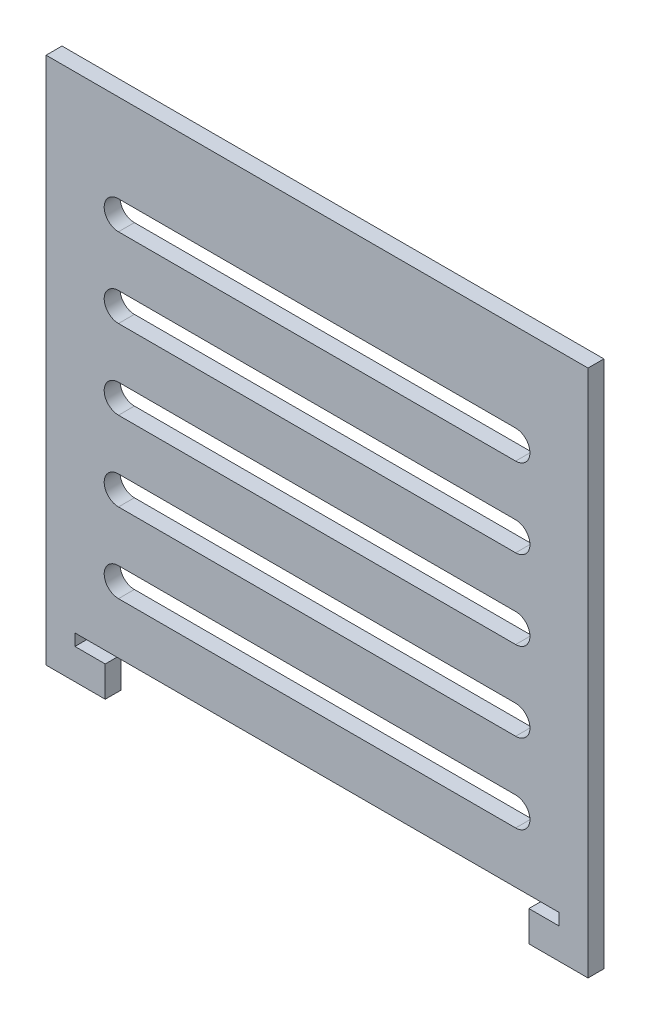
ISO-10303-21;
HEADER;
FILE_DESCRIPTION(('STEP AP214'),'2;1');
FILE_NAME('part.step','',(''),(''),'','','');
FILE_SCHEMA(('AUTOMOTIVE_DESIGN { 1 0 10303 214 1 1 1 1 }'));
ENDSEC;
DATA;
#1=APPLICATION_CONTEXT('core data for automotive mechanical design processes');
#2=APPLICATION_PROTOCOL_DEFINITION('international standard','automotive_design',2000,#1);
#3=PRODUCT_CONTEXT('',#1,'mechanical');
#4=PRODUCT('Part','Part','',(#3));
#5=PRODUCT_RELATED_PRODUCT_CATEGORY('part','',(#4));
#6=PRODUCT_DEFINITION_FORMATION('','',#4);
#7=PRODUCT_DEFINITION_CONTEXT('part definition',#1,'design');
#8=PRODUCT_DEFINITION('design','',#6,#7);
#9=PRODUCT_DEFINITION_SHAPE('','',#8);
#10=(LENGTH_UNIT() NAMED_UNIT(*) SI_UNIT(.MILLI.,.METRE.));
#11=(NAMED_UNIT(*) PLANE_ANGLE_UNIT() SI_UNIT($,.RADIAN.));
#12=(NAMED_UNIT(*) SI_UNIT($,.STERADIAN.) SOLID_ANGLE_UNIT());
#13=UNCERTAINTY_MEASURE_WITH_UNIT(LENGTH_MEASURE(1.E-05),#10,'distance_accuracy_value','');
#14=(GEOMETRIC_REPRESENTATION_CONTEXT(3) GLOBAL_UNCERTAINTY_ASSIGNED_CONTEXT((#13)) GLOBAL_UNIT_ASSIGNED_CONTEXT((#10,
#11,#12)) REPRESENTATION_CONTEXT('',''));
#15=CARTESIAN_POINT('',(0.,0.,0.));
#16=DIRECTION('',(0.,0.,1.));
#17=DIRECTION('',(1.,0.,0.));
#18=AXIS2_PLACEMENT_3D('',#15,#16,#17);
#19=CARTESIAN_POINT('',(0.,129.509583335546,5.));
#20=DIRECTION('',(0.,1.,0.));
#21=DIRECTION('',(-1.,0.,0.));
#22=AXIS2_PLACEMENT_3D('',#19,#20,#21);
#23=PLANE('',#22);
#24=DIRECTION('',(1.,0.,0.));
#25=VECTOR('',#24,1.);
#26=CARTESIAN_POINT('',(0.,129.509583335546,0.));
#27=LINE('',#26,#25);
#28=CARTESIAN_POINT('',(4.16999999999999,129.509583335546,0.));
#29=VERTEX_POINT('',#28);
#30=CARTESIAN_POINT('',(129.17,129.509583335546,0.));
#31=VERTEX_POINT('',#30);
#32=EDGE_CURVE('E87',#29,#31,#27,.T.);
#33=ORIENTED_EDGE('',*,*,#32,.F.);
#34=DIRECTION('',(0.,0.,-1.));
#35=VECTOR('',#34,1.);
#36=CARTESIAN_POINT('',(4.16999999999999,129.509583335546,5.));
#37=LINE('',#36,#35);
#38=CARTESIAN_POINT('',(4.16999999999999,129.509583335546,5.));
#39=VERTEX_POINT('',#38);
#40=EDGE_CURVE('E528',#39,#29,#37,.T.);
#41=ORIENTED_EDGE('',*,*,#40,.F.);
#42=DIRECTION('',(1.,0.,0.));
#43=VECTOR('',#42,1.);
#44=CARTESIAN_POINT('',(0.,129.509583335546,5.));
#45=LINE('',#44,#43);
#46=CARTESIAN_POINT('',(129.17,129.509583335546,5.));
#47=VERTEX_POINT('',#46);
#48=EDGE_CURVE('E12',#39,#47,#45,.T.);
#49=ORIENTED_EDGE('',*,*,#48,.T.);
#50=DIRECTION('',(0.,0.,-1.));
#51=VECTOR('',#50,1.);
#52=CARTESIAN_POINT('',(129.17,129.509583335546,5.));
#53=LINE('',#52,#51);
#54=EDGE_CURVE('E94',#47,#31,#53,.T.);
#55=ORIENTED_EDGE('',*,*,#54,.T.);
#56=EDGE_LOOP('',(#33,#41,#49,#55));
#57=FACE_BOUND('',#56,.T.);
#58=ADVANCED_FACE('F80',(#57),#23,.T.);
#59=CARTESIAN_POINT('',(129.17,134.009583335546,5.));
#60=DIRECTION('',(0.,0.,-1.));
#61=DIRECTION('',(-1.,0.,0.));
#62=AXIS2_PLACEMENT_3D('',#59,#60,#61);
#63=CYLINDRICAL_SURFACE('',#62,4.5);
#64=CARTESIAN_POINT('',(129.17,134.009583335546,0.));
#65=DIRECTION('',(0.,0.,1.));
#66=DIRECTION('',(1.,0.,0.));
#67=AXIS2_PLACEMENT_3D('',#64,#65,#66);
#68=CIRCLE('',#67,4.5);
#69=CARTESIAN_POINT('',(129.17,138.509583335546,0.));
#70=VERTEX_POINT('',#69);
#71=EDGE_CURVE('E99',#31,#70,#68,.T.);
#72=ORIENTED_EDGE('',*,*,#71,.F.);
#73=ORIENTED_EDGE('',*,*,#54,.F.);
#74=CARTESIAN_POINT('',(129.17,134.009583335546,5.));
#75=DIRECTION('',(0.,0.,1.));
#76=DIRECTION('',(1.,0.,0.));
#77=AXIS2_PLACEMENT_3D('',#74,#75,#76);
#78=CIRCLE('',#77,4.5);
#79=CARTESIAN_POINT('',(129.17,138.509583335546,5.));
#80=VERTEX_POINT('',#79);
#81=EDGE_CURVE('E533',#47,#80,#78,.T.);
#82=ORIENTED_EDGE('',*,*,#81,.T.);
#83=DIRECTION('',(0.,0.,-1.));
#84=VECTOR('',#83,1.);
#85=CARTESIAN_POINT('',(129.17,138.509583335546,5.));
#86=LINE('',#85,#84);
#87=EDGE_CURVE('E516',#80,#70,#86,.T.);
#88=ORIENTED_EDGE('',*,*,#87,.T.);
#89=EDGE_LOOP('',(#72,#73,#82,#88));
#90=FACE_BOUND('',#89,.T.);
#91=ADVANCED_FACE('F546',(#90),#63,.F.);
#92=CARTESIAN_POINT('',(4.16999999999999,134.009583335546,5.));
#93=DIRECTION('',(0.,0.,-1.));
#94=DIRECTION('',(-1.,0.,0.));
#95=AXIS2_PLACEMENT_3D('',#92,#93,#94);
#96=CYLINDRICAL_SURFACE('',#95,4.5);
#97=CARTESIAN_POINT('',(4.16999999999999,134.009583335546,0.));
#98=DIRECTION('',(0.,0.,1.));
#99=DIRECTION('',(1.,0.,0.));
#100=AXIS2_PLACEMENT_3D('',#97,#98,#99);
#101=CIRCLE('',#100,4.5);
#102=CARTESIAN_POINT('',(4.16999999999999,138.509583335546,0.));
#103=VERTEX_POINT('',#102);
#104=EDGE_CURVE('E524',#103,#29,#101,.T.);
#105=ORIENTED_EDGE('',*,*,#104,.F.);
#106=DIRECTION('',(0.,0.,-1.));
#107=VECTOR('',#106,1.);
#108=CARTESIAN_POINT('',(4.16999999999999,138.509583335546,5.));
#109=LINE('',#108,#107);
#110=CARTESIAN_POINT('',(4.16999999999999,138.509583335546,5.));
#111=VERTEX_POINT('',#110);
#112=EDGE_CURVE('E521',#111,#103,#109,.T.);
#113=ORIENTED_EDGE('',*,*,#112,.F.);
#114=CARTESIAN_POINT('',(4.16999999999999,134.009583335546,5.));
#115=DIRECTION('',(0.,0.,1.));
#116=DIRECTION('',(1.,0.,0.));
#117=AXIS2_PLACEMENT_3D('',#114,#115,#116);
#118=CIRCLE('',#117,4.5);
#119=EDGE_CURVE('E526',#111,#39,#118,.T.);
#120=ORIENTED_EDGE('',*,*,#119,.T.);
#121=ORIENTED_EDGE('',*,*,#40,.T.);
#122=EDGE_LOOP('',(#105,#113,#120,#121));
#123=FACE_BOUND('',#122,.T.);
#124=ADVANCED_FACE('F551',(#123),#96,.F.);
#125=CARTESIAN_POINT('',(0.,138.509583335546,5.));
#126=DIRECTION('',(0.,1.,0.));
#127=DIRECTION('',(0.,0.,1.));
#128=AXIS2_PLACEMENT_3D('',#125,#126,#127);
#129=PLANE('',#128);
#130=DIRECTION('',(1.,0.,0.));
#131=VECTOR('',#130,1.);
#132=CARTESIAN_POINT('',(0.,138.509583335546,0.));
#133=LINE('',#132,#131);
#134=EDGE_CURVE('E514',#103,#70,#133,.T.);
#135=ORIENTED_EDGE('',*,*,#134,.T.);
#136=ORIENTED_EDGE('',*,*,#87,.F.);
#137=DIRECTION('',(1.,0.,0.));
#138=VECTOR('',#137,1.);
#139=CARTESIAN_POINT('',(0.,138.509583335546,5.));
#140=LINE('',#139,#138);
#141=EDGE_CURVE('E518',#111,#80,#140,.T.);
#142=ORIENTED_EDGE('',*,*,#141,.F.);
#143=ORIENTED_EDGE('',*,*,#112,.T.);
#144=EDGE_LOOP('',(#135,#136,#142,#143));
#145=FACE_BOUND('',#144,.T.);
#146=ADVANCED_FACE('F548',(#145),#129,.F.);
#147=CARTESIAN_POINT('',(0.,104.509583335546,5.));
#148=DIRECTION('',(0.,1.,0.));
#149=DIRECTION('',(-1.,0.,0.));
#150=AXIS2_PLACEMENT_3D('',#147,#148,#149);
#151=PLANE('',#150);
#152=DIRECTION('',(1.,0.,0.));
#153=VECTOR('',#152,1.);
#154=CARTESIAN_POINT('',(0.,104.509583335546,0.));
#155=LINE('',#154,#153);
#156=CARTESIAN_POINT('',(4.16999999999999,104.509583335546,0.));
#157=VERTEX_POINT('',#156);
#158=CARTESIAN_POINT('',(129.17,104.509583335546,0.));
#159=VERTEX_POINT('',#158);
#160=EDGE_CURVE('E508',#157,#159,#155,.T.);
#161=ORIENTED_EDGE('',*,*,#160,.F.);
#162=DIRECTION('',(0.,0.,-1.));
#163=VECTOR('',#162,1.);
#164=CARTESIAN_POINT('',(4.16999999999999,104.509583335546,5.));
#165=LINE('',#164,#163);
#166=CARTESIAN_POINT('',(4.16999999999999,104.509583335546,5.));
#167=VERTEX_POINT('',#166);
#168=EDGE_CURVE('E496',#167,#157,#165,.T.);
#169=ORIENTED_EDGE('',*,*,#168,.F.);
#170=DIRECTION('',(1.,0.,0.));
#171=VECTOR('',#170,1.);
#172=CARTESIAN_POINT('',(0.,104.509583335546,5.));
#173=LINE('',#172,#171);
#174=CARTESIAN_POINT('',(129.17,104.509583335546,5.));
#175=VERTEX_POINT('',#174);
#176=EDGE_CURVE('E511',#167,#175,#173,.T.);
#177=ORIENTED_EDGE('',*,*,#176,.T.);
#178=DIRECTION('',(0.,0.,-1.));
#179=VECTOR('',#178,1.);
#180=CARTESIAN_POINT('',(129.17,104.509583335546,5.));
#181=LINE('',#180,#179);
#182=EDGE_CURVE('E502',#175,#159,#181,.T.);
#183=ORIENTED_EDGE('',*,*,#182,.T.);
#184=EDGE_LOOP('',(#161,#169,#177,#183));
#185=FACE_BOUND('',#184,.T.);
#186=ADVANCED_FACE('F558',(#185),#151,.T.);
#187=CARTESIAN_POINT('',(129.17,109.009583335546,5.));
#188=DIRECTION('',(0.,0.,-1.));
#189=DIRECTION('',(-1.,0.,0.));
#190=AXIS2_PLACEMENT_3D('',#187,#188,#189);
#191=CYLINDRICAL_SURFACE('',#190,4.5);
#192=CARTESIAN_POINT('',(129.17,109.009583335546,0.));
#193=DIRECTION('',(0.,0.,1.));
#194=DIRECTION('',(1.,0.,0.));
#195=AXIS2_PLACEMENT_3D('',#192,#193,#194);
#196=CIRCLE('',#195,4.5);
#197=CARTESIAN_POINT('',(129.17,113.509583335546,0.));
#198=VERTEX_POINT('',#197);
#199=EDGE_CURVE('E499',#159,#198,#196,.T.);
#200=ORIENTED_EDGE('',*,*,#199,.F.);
#201=ORIENTED_EDGE('',*,*,#182,.F.);
#202=CARTESIAN_POINT('',(129.17,109.009583335546,5.));
#203=DIRECTION('',(0.,0.,1.));
#204=DIRECTION('',(1.,0.,0.));
#205=AXIS2_PLACEMENT_3D('',#202,#203,#204);
#206=CIRCLE('',#205,4.5);
#207=CARTESIAN_POINT('',(129.17,113.509583335546,5.));
#208=VERTEX_POINT('',#207);
#209=EDGE_CURVE('E505',#175,#208,#206,.T.);
#210=ORIENTED_EDGE('',*,*,#209,.T.);
#211=DIRECTION('',(0.,0.,-1.));
#212=VECTOR('',#211,1.);
#213=CARTESIAN_POINT('',(129.17,113.509583335546,5.));
#214=LINE('',#213,#212);
#215=EDGE_CURVE('E483',#208,#198,#214,.T.);
#216=ORIENTED_EDGE('',*,*,#215,.T.);
#217=EDGE_LOOP('',(#200,#201,#210,#216));
#218=FACE_BOUND('',#217,.T.);
#219=ADVANCED_FACE('F587',(#218),#191,.F.);
#220=CARTESIAN_POINT('',(4.16999999999999,109.009583335546,5.));
#221=DIRECTION('',(0.,0.,-1.));
#222=DIRECTION('',(-1.,0.,0.));
#223=AXIS2_PLACEMENT_3D('',#220,#221,#222);
#224=CYLINDRICAL_SURFACE('',#223,4.5);
#225=CARTESIAN_POINT('',(4.16999999999999,109.009583335546,0.));
#226=DIRECTION('',(0.,0.,1.));
#227=DIRECTION('',(1.,0.,0.));
#228=AXIS2_PLACEMENT_3D('',#225,#226,#227);
#229=CIRCLE('',#228,4.5);
#230=CARTESIAN_POINT('',(4.16999999999999,113.509583335546,0.));
#231=VERTEX_POINT('',#230);
#232=EDGE_CURVE('E492',#231,#157,#229,.T.);
#233=ORIENTED_EDGE('',*,*,#232,.F.);
#234=DIRECTION('',(0.,0.,-1.));
#235=VECTOR('',#234,1.);
#236=CARTESIAN_POINT('',(4.16999999999999,113.509583335546,5.));
#237=LINE('',#236,#235);
#238=CARTESIAN_POINT('',(4.16999999999999,113.509583335546,5.));
#239=VERTEX_POINT('',#238);
#240=EDGE_CURVE('E489',#239,#231,#237,.T.);
#241=ORIENTED_EDGE('',*,*,#240,.F.);
#242=CARTESIAN_POINT('',(4.16999999999999,109.009583335546,5.));
#243=DIRECTION('',(0.,0.,1.));
#244=DIRECTION('',(1.,0.,0.));
#245=AXIS2_PLACEMENT_3D('',#242,#243,#244);
#246=CIRCLE('',#245,4.5);
#247=EDGE_CURVE('E494',#239,#167,#246,.T.);
#248=ORIENTED_EDGE('',*,*,#247,.T.);
#249=ORIENTED_EDGE('',*,*,#168,.T.);
#250=EDGE_LOOP('',(#233,#241,#248,#249));
#251=FACE_BOUND('',#250,.T.);
#252=ADVANCED_FACE('F597',(#251),#224,.F.);
#253=CARTESIAN_POINT('',(0.,113.509583335546,5.));
#254=DIRECTION('',(0.,1.,0.));
#255=DIRECTION('',(0.,0.,1.));
#256=AXIS2_PLACEMENT_3D('',#253,#254,#255);
#257=PLANE('',#256);
#258=DIRECTION('',(1.,0.,0.));
#259=VECTOR('',#258,1.);
#260=CARTESIAN_POINT('',(0.,113.509583335546,0.));
#261=LINE('',#260,#259);
#262=EDGE_CURVE('E481',#231,#198,#261,.T.);
#263=ORIENTED_EDGE('',*,*,#262,.T.);
#264=ORIENTED_EDGE('',*,*,#215,.F.);
#265=DIRECTION('',(1.,0.,0.));
#266=VECTOR('',#265,1.);
#267=CARTESIAN_POINT('',(0.,113.509583335546,5.));
#268=LINE('',#267,#266);
#269=EDGE_CURVE('E486',#239,#208,#268,.T.);
#270=ORIENTED_EDGE('',*,*,#269,.F.);
#271=ORIENTED_EDGE('',*,*,#240,.T.);
#272=EDGE_LOOP('',(#263,#264,#270,#271));
#273=FACE_BOUND('',#272,.T.);
#274=ADVANCED_FACE('F607',(#273),#257,.F.);
#275=CARTESIAN_POINT('',(0.,79.5095833355463,5.));
#276=DIRECTION('',(0.,1.,0.));
#277=DIRECTION('',(-1.,0.,0.));
#278=AXIS2_PLACEMENT_3D('',#275,#276,#277);
#279=PLANE('',#278);
#280=DIRECTION('',(1.,0.,0.));
#281=VECTOR('',#280,1.);
#282=CARTESIAN_POINT('',(0.,79.5095833355463,0.));
#283=LINE('',#282,#281);
#284=CARTESIAN_POINT('',(4.16999999999999,79.5095833355463,0.));
#285=VERTEX_POINT('',#284);
#286=CARTESIAN_POINT('',(129.17,79.5095833355463,0.));
#287=VERTEX_POINT('',#286);
#288=EDGE_CURVE('E475',#285,#287,#283,.T.);
#289=ORIENTED_EDGE('',*,*,#288,.F.);
#290=DIRECTION('',(0.,0.,-1.));
#291=VECTOR('',#290,1.);
#292=CARTESIAN_POINT('',(4.16999999999999,79.5095833355463,5.));
#293=LINE('',#292,#291);
#294=CARTESIAN_POINT('',(4.16999999999999,79.5095833355463,5.));
#295=VERTEX_POINT('',#294);
#296=EDGE_CURVE('E463',#295,#285,#293,.T.);
#297=ORIENTED_EDGE('',*,*,#296,.F.);
#298=DIRECTION('',(1.,0.,0.));
#299=VECTOR('',#298,1.);
#300=CARTESIAN_POINT('',(0.,79.5095833355463,5.));
#301=LINE('',#300,#299);
#302=CARTESIAN_POINT('',(129.17,79.5095833355463,5.));
#303=VERTEX_POINT('',#302);
#304=EDGE_CURVE('E478',#295,#303,#301,.T.);
#305=ORIENTED_EDGE('',*,*,#304,.T.);
#306=DIRECTION('',(0.,0.,-1.));
#307=VECTOR('',#306,1.);
#308=CARTESIAN_POINT('',(129.17,79.5095833355463,5.));
#309=LINE('',#308,#307);
#310=EDGE_CURVE('E469',#303,#287,#309,.T.);
#311=ORIENTED_EDGE('',*,*,#310,.T.);
#312=EDGE_LOOP('',(#289,#297,#305,#311));
#313=FACE_BOUND('',#312,.T.);
#314=ADVANCED_FACE('F617',(#313),#279,.T.);
#315=CARTESIAN_POINT('',(129.17,84.0095833355463,5.));
#316=DIRECTION('',(0.,0.,-1.));
#317=DIRECTION('',(-1.,0.,0.));
#318=AXIS2_PLACEMENT_3D('',#315,#316,#317);
#319=CYLINDRICAL_SURFACE('',#318,4.5);
#320=CARTESIAN_POINT('',(129.17,84.0095833355463,0.));
#321=DIRECTION('',(0.,0.,1.));
#322=DIRECTION('',(1.,0.,0.));
#323=AXIS2_PLACEMENT_3D('',#320,#321,#322);
#324=CIRCLE('',#323,4.5);
#325=CARTESIAN_POINT('',(129.17,88.5095833355463,0.));
#326=VERTEX_POINT('',#325);
#327=EDGE_CURVE('E466',#287,#326,#324,.T.);
#328=ORIENTED_EDGE('',*,*,#327,.F.);
#329=ORIENTED_EDGE('',*,*,#310,.F.);
#330=CARTESIAN_POINT('',(129.17,84.0095833355463,5.));
#331=DIRECTION('',(0.,0.,1.));
#332=DIRECTION('',(1.,0.,0.));
#333=AXIS2_PLACEMENT_3D('',#330,#331,#332);
#334=CIRCLE('',#333,4.5);
#335=CARTESIAN_POINT('',(129.17,88.5095833355463,5.));
#336=VERTEX_POINT('',#335);
#337=EDGE_CURVE('E472',#303,#336,#334,.T.);
#338=ORIENTED_EDGE('',*,*,#337,.T.);
#339=DIRECTION('',(0.,0.,-1.));
#340=VECTOR('',#339,1.);
#341=CARTESIAN_POINT('',(129.17,88.5095833355463,5.));
#342=LINE('',#341,#340);
#343=EDGE_CURVE('E450',#336,#326,#342,.T.);
#344=ORIENTED_EDGE('',*,*,#343,.T.);
#345=EDGE_LOOP('',(#328,#329,#338,#344));
#346=FACE_BOUND('',#345,.T.);
#347=ADVANCED_FACE('F627',(#346),#319,.F.);
#348=CARTESIAN_POINT('',(4.16999999999999,84.0095833355463,5.));
#349=DIRECTION('',(0.,0.,-1.));
#350=DIRECTION('',(-1.,0.,0.));
#351=AXIS2_PLACEMENT_3D('',#348,#349,#350);
#352=CYLINDRICAL_SURFACE('',#351,4.5);
#353=CARTESIAN_POINT('',(4.16999999999999,84.0095833355463,0.));
#354=DIRECTION('',(0.,0.,1.));
#355=DIRECTION('',(1.,0.,0.));
#356=AXIS2_PLACEMENT_3D('',#353,#354,#355);
#357=CIRCLE('',#356,4.5);
#358=CARTESIAN_POINT('',(4.16999999999999,88.5095833355463,0.));
#359=VERTEX_POINT('',#358);
#360=EDGE_CURVE('E459',#359,#285,#357,.T.);
#361=ORIENTED_EDGE('',*,*,#360,.F.);
#362=DIRECTION('',(0.,0.,-1.));
#363=VECTOR('',#362,1.);
#364=CARTESIAN_POINT('',(4.16999999999999,88.5095833355463,5.));
#365=LINE('',#364,#363);
#366=CARTESIAN_POINT('',(4.16999999999999,88.5095833355463,5.));
#367=VERTEX_POINT('',#366);
#368=EDGE_CURVE('E456',#367,#359,#365,.T.);
#369=ORIENTED_EDGE('',*,*,#368,.F.);
#370=CARTESIAN_POINT('',(4.16999999999999,84.0095833355463,5.));
#371=DIRECTION('',(0.,0.,1.));
#372=DIRECTION('',(1.,0.,0.));
#373=AXIS2_PLACEMENT_3D('',#370,#371,#372);
#374=CIRCLE('',#373,4.5);
#375=EDGE_CURVE('E461',#367,#295,#374,.T.);
#376=ORIENTED_EDGE('',*,*,#375,.T.);
#377=ORIENTED_EDGE('',*,*,#296,.T.);
#378=EDGE_LOOP('',(#361,#369,#376,#377));
#379=FACE_BOUND('',#378,.T.);
#380=ADVANCED_FACE('F637',(#379),#352,.F.);
#381=CARTESIAN_POINT('',(0.,88.5095833355463,5.));
#382=DIRECTION('',(0.,1.,0.));
#383=DIRECTION('',(0.,0.,1.));
#384=AXIS2_PLACEMENT_3D('',#381,#382,#383);
#385=PLANE('',#384);
#386=DIRECTION('',(1.,0.,0.));
#387=VECTOR('',#386,1.);
#388=CARTESIAN_POINT('',(0.,88.5095833355463,0.));
#389=LINE('',#388,#387);
#390=EDGE_CURVE('E448',#359,#326,#389,.T.);
#391=ORIENTED_EDGE('',*,*,#390,.T.);
#392=ORIENTED_EDGE('',*,*,#343,.F.);
#393=DIRECTION('',(1.,0.,0.));
#394=VECTOR('',#393,1.);
#395=CARTESIAN_POINT('',(0.,88.5095833355463,5.));
#396=LINE('',#395,#394);
#397=EDGE_CURVE('E453',#367,#336,#396,.T.);
#398=ORIENTED_EDGE('',*,*,#397,.F.);
#399=ORIENTED_EDGE('',*,*,#368,.T.);
#400=EDGE_LOOP('',(#391,#392,#398,#399));
#401=FACE_BOUND('',#400,.T.);
#402=ADVANCED_FACE('F647',(#401),#385,.F.);
#403=CARTESIAN_POINT('',(0.,54.5095833355463,5.));
#404=DIRECTION('',(0.,1.,0.));
#405=DIRECTION('',(-1.,0.,0.));
#406=AXIS2_PLACEMENT_3D('',#403,#404,#405);
#407=PLANE('',#406);
#408=DIRECTION('',(1.,0.,0.));
#409=VECTOR('',#408,1.);
#410=CARTESIAN_POINT('',(0.,54.5095833355463,0.));
#411=LINE('',#410,#409);
#412=CARTESIAN_POINT('',(4.16999999999999,54.5095833355463,0.));
#413=VERTEX_POINT('',#412);
#414=CARTESIAN_POINT('',(129.17,54.5095833355463,0.));
#415=VERTEX_POINT('',#414);
#416=EDGE_CURVE('E442',#413,#415,#411,.T.);
#417=ORIENTED_EDGE('',*,*,#416,.F.);
#418=DIRECTION('',(0.,0.,-1.));
#419=VECTOR('',#418,1.);
#420=CARTESIAN_POINT('',(4.16999999999999,54.5095833355463,5.));
#421=LINE('',#420,#419);
#422=CARTESIAN_POINT('',(4.16999999999999,54.5095833355463,5.));
#423=VERTEX_POINT('',#422);
#424=EDGE_CURVE('E430',#423,#413,#421,.T.);
#425=ORIENTED_EDGE('',*,*,#424,.F.);
#426=DIRECTION('',(1.,0.,0.));
#427=VECTOR('',#426,1.);
#428=CARTESIAN_POINT('',(0.,54.5095833355463,5.));
#429=LINE('',#428,#427);
#430=CARTESIAN_POINT('',(129.17,54.5095833355463,5.));
#431=VERTEX_POINT('',#430);
#432=EDGE_CURVE('E445',#423,#431,#429,.T.);
#433=ORIENTED_EDGE('',*,*,#432,.T.);
#434=DIRECTION('',(0.,0.,-1.));
#435=VECTOR('',#434,1.);
#436=CARTESIAN_POINT('',(129.17,54.5095833355463,5.));
#437=LINE('',#436,#435);
#438=EDGE_CURVE('E436',#431,#415,#437,.T.);
#439=ORIENTED_EDGE('',*,*,#438,.T.);
#440=EDGE_LOOP('',(#417,#425,#433,#439));
#441=FACE_BOUND('',#440,.T.);
#442=ADVANCED_FACE('F657',(#441),#407,.T.);
#443=CARTESIAN_POINT('',(129.17,59.0095833355463,5.));
#444=DIRECTION('',(0.,0.,-1.));
#445=DIRECTION('',(-1.,0.,0.));
#446=AXIS2_PLACEMENT_3D('',#443,#444,#445);
#447=CYLINDRICAL_SURFACE('',#446,4.5);
#448=CARTESIAN_POINT('',(129.17,59.0095833355463,0.));
#449=DIRECTION('',(0.,0.,1.));
#450=DIRECTION('',(1.,0.,0.));
#451=AXIS2_PLACEMENT_3D('',#448,#449,#450);
#452=CIRCLE('',#451,4.5);
#453=CARTESIAN_POINT('',(129.17,63.5095833355463,0.));
#454=VERTEX_POINT('',#453);
#455=EDGE_CURVE('E433',#415,#454,#452,.T.);
#456=ORIENTED_EDGE('',*,*,#455,.F.);
#457=ORIENTED_EDGE('',*,*,#438,.F.);
#458=CARTESIAN_POINT('',(129.17,59.0095833355463,5.));
#459=DIRECTION('',(0.,0.,1.));
#460=DIRECTION('',(1.,0.,0.));
#461=AXIS2_PLACEMENT_3D('',#458,#459,#460);
#462=CIRCLE('',#461,4.5);
#463=CARTESIAN_POINT('',(129.17,63.5095833355463,5.));
#464=VERTEX_POINT('',#463);
#465=EDGE_CURVE('E439',#431,#464,#462,.T.);
#466=ORIENTED_EDGE('',*,*,#465,.T.);
#467=DIRECTION('',(0.,0.,-1.));
#468=VECTOR('',#467,1.);
#469=CARTESIAN_POINT('',(129.17,63.5095833355463,5.));
#470=LINE('',#469,#468);
#471=EDGE_CURVE('E417',#464,#454,#470,.T.);
#472=ORIENTED_EDGE('',*,*,#471,.T.);
#473=EDGE_LOOP('',(#456,#457,#466,#472));
#474=FACE_BOUND('',#473,.T.);
#475=ADVANCED_FACE('F667',(#474),#447,.F.);
#476=CARTESIAN_POINT('',(4.16999999999999,59.0095833355463,5.));
#477=DIRECTION('',(0.,0.,-1.));
#478=DIRECTION('',(-1.,0.,0.));
#479=AXIS2_PLACEMENT_3D('',#476,#477,#478);
#480=CYLINDRICAL_SURFACE('',#479,4.5);
#481=CARTESIAN_POINT('',(4.16999999999999,59.0095833355463,0.));
#482=DIRECTION('',(0.,0.,1.));
#483=DIRECTION('',(1.,0.,0.));
#484=AXIS2_PLACEMENT_3D('',#481,#482,#483);
#485=CIRCLE('',#484,4.5);
#486=CARTESIAN_POINT('',(4.16999999999999,63.5095833355463,0.));
#487=VERTEX_POINT('',#486);
#488=EDGE_CURVE('E426',#487,#413,#485,.T.);
#489=ORIENTED_EDGE('',*,*,#488,.F.);
#490=DIRECTION('',(0.,0.,-1.));
#491=VECTOR('',#490,1.);
#492=CARTESIAN_POINT('',(4.16999999999999,63.5095833355463,5.));
#493=LINE('',#492,#491);
#494=CARTESIAN_POINT('',(4.16999999999999,63.5095833355463,5.));
#495=VERTEX_POINT('',#494);
#496=EDGE_CURVE('E423',#495,#487,#493,.T.);
#497=ORIENTED_EDGE('',*,*,#496,.F.);
#498=CARTESIAN_POINT('',(4.16999999999999,59.0095833355463,5.));
#499=DIRECTION('',(0.,0.,1.));
#500=DIRECTION('',(1.,0.,0.));
#501=AXIS2_PLACEMENT_3D('',#498,#499,#500);
#502=CIRCLE('',#501,4.5);
#503=EDGE_CURVE('E428',#495,#423,#502,.T.);
#504=ORIENTED_EDGE('',*,*,#503,.T.);
#505=ORIENTED_EDGE('',*,*,#424,.T.);
#506=EDGE_LOOP('',(#489,#497,#504,#505));
#507=FACE_BOUND('',#506,.T.);
#508=ADVANCED_FACE('F677',(#507),#480,.F.);
#509=CARTESIAN_POINT('',(0.,63.5095833355463,5.));
#510=DIRECTION('',(0.,1.,0.));
#511=DIRECTION('',(0.,0.,1.));
#512=AXIS2_PLACEMENT_3D('',#509,#510,#511);
#513=PLANE('',#512);
#514=DIRECTION('',(1.,0.,0.));
#515=VECTOR('',#514,1.);
#516=CARTESIAN_POINT('',(0.,63.5095833355463,0.));
#517=LINE('',#516,#515);
#518=EDGE_CURVE('E415',#487,#454,#517,.T.);
#519=ORIENTED_EDGE('',*,*,#518,.T.);
#520=ORIENTED_EDGE('',*,*,#471,.F.);
#521=DIRECTION('',(1.,0.,0.));
#522=VECTOR('',#521,1.);
#523=CARTESIAN_POINT('',(0.,63.5095833355463,5.));
#524=LINE('',#523,#522);
#525=EDGE_CURVE('E420',#495,#464,#524,.T.);
#526=ORIENTED_EDGE('',*,*,#525,.F.);
#527=ORIENTED_EDGE('',*,*,#496,.T.);
#528=EDGE_LOOP('',(#519,#520,#526,#527));
#529=FACE_BOUND('',#528,.T.);
#530=ADVANCED_FACE('F687',(#529),#513,.F.);
#531=CARTESIAN_POINT('',(0.,0.,5.));
#532=DIRECTION('',(0.,0.,1.));
#533=DIRECTION('',(1.,0.,0.));
#534=AXIS2_PLACEMENT_3D('',#531,#532,#533);
#535=PLANE('',#534);
#536=ORIENTED_EDGE('',*,*,#81,.F.);
#537=ORIENTED_EDGE('',*,*,#48,.F.);
#538=ORIENTED_EDGE('',*,*,#119,.F.);
#539=ORIENTED_EDGE('',*,*,#141,.T.);
#540=EDGE_LOOP('',(#536,#537,#538,#539));
#541=FACE_BOUND('',#540,.T.);
#542=ORIENTED_EDGE('',*,*,#209,.F.);
#543=ORIENTED_EDGE('',*,*,#176,.F.);
#544=ORIENTED_EDGE('',*,*,#247,.F.);
#545=ORIENTED_EDGE('',*,*,#269,.T.);
#546=EDGE_LOOP('',(#542,#543,#544,#545));
#547=FACE_BOUND('',#546,.T.);
#548=ORIENTED_EDGE('',*,*,#337,.F.);
#549=ORIENTED_EDGE('',*,*,#304,.F.);
#550=ORIENTED_EDGE('',*,*,#375,.F.);
#551=ORIENTED_EDGE('',*,*,#397,.T.);
#552=EDGE_LOOP('',(#548,#549,#550,#551));
#553=FACE_BOUND('',#552,.T.);
#554=ORIENTED_EDGE('',*,*,#465,.F.);
#555=ORIENTED_EDGE('',*,*,#432,.F.);
#556=ORIENTED_EDGE('',*,*,#503,.F.);
#557=ORIENTED_EDGE('',*,*,#525,.T.);
#558=EDGE_LOOP('',(#554,#555,#556,#557));
#559=FACE_BOUND('',#558,.T.);
#560=DIRECTION('',(-1.,0.,0.));
#561=VECTOR('',#560,1.);
#562=CARTESIAN_POINT('',(151.95,166.26,5.));
#563=LINE('',#562,#561);
#564=CARTESIAN_POINT('',(151.95,166.26,5.));
#565=VERTEX_POINT('',#564);
#566=CARTESIAN_POINT('',(-18.61,166.26,5.));
#567=VERTEX_POINT('',#566);
#568=EDGE_CURVE('E330',#565,#567,#563,.T.);
#569=ORIENTED_EDGE('',*,*,#568,.T.);
#570=DIRECTION('',(0.,-1.,0.));
#571=VECTOR('',#570,1.);
#572=CARTESIAN_POINT('',(-18.61,166.26,5.));
#573=LINE('',#572,#571);
#574=CARTESIAN_POINT('',(-18.61,0.,5.));
#575=VERTEX_POINT('',#574);
#576=EDGE_CURVE('E333',#567,#575,#573,.T.);
#577=ORIENTED_EDGE('',*,*,#576,.T.);
#578=DIRECTION('',(1.,0.,0.));
#579=VECTOR('',#578,1.);
#580=CARTESIAN_POINT('',(-18.61,0.,5.));
#581=LINE('',#580,#579);
#582=CARTESIAN_POINT('',(0.,0.,5.));
#583=VERTEX_POINT('',#582);
#584=EDGE_CURVE('E336',#575,#583,#581,.T.);
#585=ORIENTED_EDGE('',*,*,#584,.T.);
#586=DIRECTION('',(0.,1.,0.));
#587=VECTOR('',#586,1.);
#588=CARTESIAN_POINT('',(0.,0.,5.));
#589=LINE('',#588,#587);
#590=CARTESIAN_POINT('',(0.,9.63,5.));
#591=VERTEX_POINT('',#590);
#592=EDGE_CURVE('E338',#583,#591,#589,.T.);
#593=ORIENTED_EDGE('',*,*,#592,.T.);
#594=DIRECTION('',(-1.,0.,0.));
#595=VECTOR('',#594,1.);
#596=CARTESIAN_POINT('',(0.,9.63,5.));
#597=LINE('',#596,#595);
#598=CARTESIAN_POINT('',(-9.53000000000001,9.63000000000001,5.));
#599=VERTEX_POINT('',#598);
#600=EDGE_CURVE('E340',#591,#599,#597,.T.);
#601=ORIENTED_EDGE('',*,*,#600,.T.);
#602=DIRECTION('',(0.,1.,0.));
#603=VECTOR('',#602,1.);
#604=CARTESIAN_POINT('',(-9.53000000000001,9.63000000000001,5.));
#605=LINE('',#604,#603);
#606=CARTESIAN_POINT('',(-9.53000000000001,13.32,5.));
#607=VERTEX_POINT('',#606);
#608=EDGE_CURVE('E342',#599,#607,#605,.T.);
#609=ORIENTED_EDGE('',*,*,#608,.T.);
#610=DIRECTION('',(1.,0.,0.));
#611=VECTOR('',#610,1.);
#612=CARTESIAN_POINT('',(-9.53000000000001,13.32,5.));
#613=LINE('',#612,#611);
#614=CARTESIAN_POINT('',(142.87,13.32,5.));
#615=VERTEX_POINT('',#614);
#616=EDGE_CURVE('E344',#607,#615,#613,.T.);
#617=ORIENTED_EDGE('',*,*,#616,.T.);
#618=DIRECTION('',(0.,-1.,0.));
#619=VECTOR('',#618,1.);
#620=CARTESIAN_POINT('',(142.87,13.32,5.));
#621=LINE('',#620,#619);
#622=CARTESIAN_POINT('',(142.87,9.63000000000001,5.));
#623=VERTEX_POINT('',#622);
#624=EDGE_CURVE('E346',#615,#623,#621,.T.);
#625=ORIENTED_EDGE('',*,*,#624,.T.);
#626=DIRECTION('',(-1.,0.,0.));
#627=VECTOR('',#626,1.);
#628=CARTESIAN_POINT('',(142.87,9.63000000000001,5.));
#629=LINE('',#628,#627);
#630=CARTESIAN_POINT('',(133.34,9.63000000000002,5.));
#631=VERTEX_POINT('',#630);
#632=EDGE_CURVE('E348',#623,#631,#629,.T.);
#633=ORIENTED_EDGE('',*,*,#632,.T.);
#634=DIRECTION('',(0.,-1.,0.));
#635=VECTOR('',#634,1.);
#636=CARTESIAN_POINT('',(133.34,9.63000000000002,5.));
#637=LINE('',#636,#635);
#638=CARTESIAN_POINT('',(133.34,0.,5.));
#639=VERTEX_POINT('',#638);
#640=EDGE_CURVE('E350',#631,#639,#637,.T.);
#641=ORIENTED_EDGE('',*,*,#640,.T.);
#642=DIRECTION('',(1.,0.,0.));
#643=VECTOR('',#642,1.);
#644=CARTESIAN_POINT('',(133.34,0.,5.));
#645=LINE('',#644,#643);
#646=CARTESIAN_POINT('',(151.95,0.,5.));
#647=VERTEX_POINT('',#646);
#648=EDGE_CURVE('E352',#639,#647,#645,.T.);
#649=ORIENTED_EDGE('',*,*,#648,.T.);
#650=DIRECTION('',(0.,1.,0.));
#651=VECTOR('',#650,1.);
#652=CARTESIAN_POINT('',(151.95,0.,5.));
#653=LINE('',#652,#651);
#654=EDGE_CURVE('E354',#647,#565,#653,.T.);
#655=ORIENTED_EDGE('',*,*,#654,.T.);
#656=EDGE_LOOP('',(#569,#577,#585,#593,#601,#609,#617,#625,#633,#641,#649,#655));
#657=FACE_BOUND('',#656,.T.);
#658=CARTESIAN_POINT('',(129.17,34.0095833355463,5.));
#659=DIRECTION('',(0.,0.,1.));
#660=DIRECTION('',(1.,0.,0.));
#661=AXIS2_PLACEMENT_3D('',#658,#659,#660);
#662=CIRCLE('',#661,4.5);
#663=CARTESIAN_POINT('',(129.17,29.5095833355463,5.));
#664=VERTEX_POINT('',#663);
#665=CARTESIAN_POINT('',(129.17,38.5095833355463,5.));
#666=VERTEX_POINT('',#665);
#667=EDGE_CURVE('E299',#664,#666,#662,.T.);
#668=ORIENTED_EDGE('',*,*,#667,.F.);
#669=DIRECTION('',(1.,0.,0.));
#670=VECTOR('',#669,1.);
#671=CARTESIAN_POINT('',(0.,29.5095833355463,5.));
#672=LINE('',#671,#670);
#673=CARTESIAN_POINT('',(4.16999999999999,29.5095833355463,5.));
#674=VERTEX_POINT('',#673);
#675=EDGE_CURVE('E289',#674,#664,#672,.T.);
#676=ORIENTED_EDGE('',*,*,#675,.F.);
#677=CARTESIAN_POINT('',(4.16999999999999,34.0095833355463,5.));
#678=DIRECTION('',(0.,0.,1.));
#679=DIRECTION('',(1.,0.,0.));
#680=AXIS2_PLACEMENT_3D('',#677,#678,#679);
#681=CIRCLE('',#680,4.5);
#682=CARTESIAN_POINT('',(4.16999999999999,38.5095833355463,5.));
#683=VERTEX_POINT('',#682);
#684=EDGE_CURVE('E314',#683,#674,#681,.T.);
#685=ORIENTED_EDGE('',*,*,#684,.F.);
#686=DIRECTION('',(1.,0.,0.));
#687=VECTOR('',#686,1.);
#688=CARTESIAN_POINT('',(0.,38.5095833355463,5.));
#689=LINE('',#688,#687);
#690=EDGE_CURVE('E312',#683,#666,#689,.T.);
#691=ORIENTED_EDGE('',*,*,#690,.T.);
#692=EDGE_LOOP('',(#668,#676,#685,#691));
#693=FACE_BOUND('',#692,.T.);
#694=ADVANCED_FACE('F311',(#541,#547,#553,#559,#657,#693),#535,.T.);
#695=CARTESIAN_POINT('',(0.,0.,0.));
#696=DIRECTION('',(0.,0.,1.));
#697=DIRECTION('',(1.,0.,0.));
#698=AXIS2_PLACEMENT_3D('',#695,#696,#697);
#699=PLANE('',#698);
#700=ORIENTED_EDGE('',*,*,#32,.T.);
#701=ORIENTED_EDGE('',*,*,#71,.T.);
#702=ORIENTED_EDGE('',*,*,#134,.F.);
#703=ORIENTED_EDGE('',*,*,#104,.T.);
#704=EDGE_LOOP('',(#700,#701,#702,#703));
#705=FACE_BOUND('',#704,.T.);
#706=ORIENTED_EDGE('',*,*,#160,.T.);
#707=ORIENTED_EDGE('',*,*,#199,.T.);
#708=ORIENTED_EDGE('',*,*,#262,.F.);
#709=ORIENTED_EDGE('',*,*,#232,.T.);
#710=EDGE_LOOP('',(#706,#707,#708,#709));
#711=FACE_BOUND('',#710,.T.);
#712=ORIENTED_EDGE('',*,*,#288,.T.);
#713=ORIENTED_EDGE('',*,*,#327,.T.);
#714=ORIENTED_EDGE('',*,*,#390,.F.);
#715=ORIENTED_EDGE('',*,*,#360,.T.);
#716=EDGE_LOOP('',(#712,#713,#714,#715));
#717=FACE_BOUND('',#716,.T.);
#718=ORIENTED_EDGE('',*,*,#416,.T.);
#719=ORIENTED_EDGE('',*,*,#455,.T.);
#720=ORIENTED_EDGE('',*,*,#518,.F.);
#721=ORIENTED_EDGE('',*,*,#488,.T.);
#722=EDGE_LOOP('',(#718,#719,#720,#721));
#723=FACE_BOUND('',#722,.T.);
#724=DIRECTION('',(-1.,0.,0.));
#725=VECTOR('',#724,1.);
#726=CARTESIAN_POINT('',(151.95,166.26,0.));
#727=LINE('',#726,#725);
#728=CARTESIAN_POINT('',(151.95,166.26,0.));
#729=VERTEX_POINT('',#728);
#730=CARTESIAN_POINT('',(-18.61,166.26,0.));
#731=VERTEX_POINT('',#730);
#732=EDGE_CURVE('E307',#729,#731,#727,.T.);
#733=ORIENTED_EDGE('',*,*,#732,.F.);
#734=DIRECTION('',(0.,1.,0.));
#735=VECTOR('',#734,1.);
#736=CARTESIAN_POINT('',(151.95,0.,0.));
#737=LINE('',#736,#735);
#738=CARTESIAN_POINT('',(151.95,0.,0.));
#739=VERTEX_POINT('',#738);
#740=EDGE_CURVE('E334',#739,#729,#737,.T.);
#741=ORIENTED_EDGE('',*,*,#740,.F.);
#742=DIRECTION('',(1.,0.,0.));
#743=VECTOR('',#742,1.);
#744=CARTESIAN_POINT('',(133.34,0.,0.));
#745=LINE('',#744,#743);
#746=CARTESIAN_POINT('',(133.34,0.,0.));
#747=VERTEX_POINT('',#746);
#748=EDGE_CURVE('E377',#747,#739,#745,.T.);
#749=ORIENTED_EDGE('',*,*,#748,.F.);
#750=DIRECTION('',(0.,-1.,0.));
#751=VECTOR('',#750,1.);
#752=CARTESIAN_POINT('',(133.34,9.63000000000002,0.));
#753=LINE('',#752,#751);
#754=CARTESIAN_POINT('',(133.34,9.63000000000002,0.));
#755=VERTEX_POINT('',#754);
#756=EDGE_CURVE('E375',#755,#747,#753,.T.);
#757=ORIENTED_EDGE('',*,*,#756,.F.);
#758=DIRECTION('',(-1.,0.,0.));
#759=VECTOR('',#758,1.);
#760=CARTESIAN_POINT('',(142.87,9.63000000000001,0.));
#761=LINE('',#760,#759);
#762=CARTESIAN_POINT('',(142.87,9.63000000000001,0.));
#763=VERTEX_POINT('',#762);
#764=EDGE_CURVE('E373',#763,#755,#761,.T.);
#765=ORIENTED_EDGE('',*,*,#764,.F.);
#766=DIRECTION('',(0.,-1.,0.));
#767=VECTOR('',#766,1.);
#768=CARTESIAN_POINT('',(142.87,13.32,0.));
#769=LINE('',#768,#767);
#770=CARTESIAN_POINT('',(142.87,13.32,0.));
#771=VERTEX_POINT('',#770);
#772=EDGE_CURVE('E371',#771,#763,#769,.T.);
#773=ORIENTED_EDGE('',*,*,#772,.F.);
#774=DIRECTION('',(1.,0.,0.));
#775=VECTOR('',#774,1.);
#776=CARTESIAN_POINT('',(-9.53000000000001,13.32,0.));
#777=LINE('',#776,#775);
#778=CARTESIAN_POINT('',(-9.53000000000001,13.32,0.));
#779=VERTEX_POINT('',#778);
#780=EDGE_CURVE('E369',#779,#771,#777,.T.);
#781=ORIENTED_EDGE('',*,*,#780,.F.);
#782=DIRECTION('',(0.,1.,0.));
#783=VECTOR('',#782,1.);
#784=CARTESIAN_POINT('',(-9.53000000000001,9.63000000000001,0.));
#785=LINE('',#784,#783);
#786=CARTESIAN_POINT('',(-9.53000000000001,9.63000000000001,0.));
#787=VERTEX_POINT('',#786);
#788=EDGE_CURVE('E367',#787,#779,#785,.T.);
#789=ORIENTED_EDGE('',*,*,#788,.F.);
#790=DIRECTION('',(-1.,0.,0.));
#791=VECTOR('',#790,1.);
#792=CARTESIAN_POINT('',(0.,9.63,0.));
#793=LINE('',#792,#791);
#794=CARTESIAN_POINT('',(0.,9.63,0.));
#795=VERTEX_POINT('',#794);
#796=EDGE_CURVE('E365',#795,#787,#793,.T.);
#797=ORIENTED_EDGE('',*,*,#796,.F.);
#798=DIRECTION('',(0.,1.,0.));
#799=VECTOR('',#798,1.);
#800=CARTESIAN_POINT('',(0.,0.,0.));
#801=LINE('',#800,#799);
#802=CARTESIAN_POINT('',(0.,0.,0.));
#803=VERTEX_POINT('',#802);
#804=EDGE_CURVE('E363',#803,#795,#801,.T.);
#805=ORIENTED_EDGE('',*,*,#804,.F.);
#806=DIRECTION('',(1.,0.,0.));
#807=VECTOR('',#806,1.);
#808=CARTESIAN_POINT('',(-18.61,0.,0.));
#809=LINE('',#808,#807);
#810=CARTESIAN_POINT('',(-18.61,0.,0.));
#811=VERTEX_POINT('',#810);
#812=EDGE_CURVE('E361',#811,#803,#809,.T.);
#813=ORIENTED_EDGE('',*,*,#812,.F.);
#814=DIRECTION('',(0.,-1.,0.));
#815=VECTOR('',#814,1.);
#816=CARTESIAN_POINT('',(-18.61,166.26,0.));
#817=LINE('',#816,#815);
#818=EDGE_CURVE('E359',#731,#811,#817,.T.);
#819=ORIENTED_EDGE('',*,*,#818,.F.);
#820=EDGE_LOOP('',(#733,#741,#749,#757,#765,#773,#781,#789,#797,#805,#813,#819));
#821=FACE_BOUND('',#820,.T.);
#822=DIRECTION('',(1.,0.,0.));
#823=VECTOR('',#822,1.);
#824=CARTESIAN_POINT('',(0.,29.5095833355463,0.));
#825=LINE('',#824,#823);
#826=CARTESIAN_POINT('',(4.16999999999999,29.5095833355463,0.));
#827=VERTEX_POINT('',#826);
#828=CARTESIAN_POINT('',(129.17,29.5095833355463,0.));
#829=VERTEX_POINT('',#828);
#830=EDGE_CURVE('E318',#827,#829,#825,.T.);
#831=ORIENTED_EDGE('',*,*,#830,.T.);
#832=CARTESIAN_POINT('',(129.17,34.0095833355463,0.));
#833=DIRECTION('',(0.,0.,1.));
#834=DIRECTION('',(1.,0.,0.));
#835=AXIS2_PLACEMENT_3D('',#832,#833,#834);
#836=CIRCLE('',#835,4.5);
#837=CARTESIAN_POINT('',(129.17,38.5095833355463,0.));
#838=VERTEX_POINT('',#837);
#839=EDGE_CURVE('E306',#829,#838,#836,.T.);
#840=ORIENTED_EDGE('',*,*,#839,.T.);
#841=DIRECTION('',(1.,0.,0.));
#842=VECTOR('',#841,1.);
#843=CARTESIAN_POINT('',(0.,38.5095833355463,0.));
#844=LINE('',#843,#842);
#845=CARTESIAN_POINT('',(4.16999999999999,38.5095833355463,0.));
#846=VERTEX_POINT('',#845);
#847=EDGE_CURVE('E321',#846,#838,#844,.T.);
#848=ORIENTED_EDGE('',*,*,#847,.F.);
#849=CARTESIAN_POINT('',(4.16999999999999,34.0095833355463,0.));
#850=DIRECTION('',(0.,0.,1.));
#851=DIRECTION('',(1.,0.,0.));
#852=AXIS2_PLACEMENT_3D('',#849,#850,#851);
#853=CIRCLE('',#852,4.5);
#854=EDGE_CURVE('E300',#846,#827,#853,.T.);
#855=ORIENTED_EDGE('',*,*,#854,.T.);
#856=EDGE_LOOP('',(#831,#840,#848,#855));
#857=FACE_BOUND('',#856,.T.);
#858=ADVANCED_FACE('F537',(#705,#711,#717,#723,#821,#857),#699,.F.);
#859=CARTESIAN_POINT('',(151.95,166.26,5.));
#860=DIRECTION('',(0.,-1.,0.));
#861=DIRECTION('',(1.,0.,0.));
#862=AXIS2_PLACEMENT_3D('',#859,#860,#861);
#863=PLANE('',#862);
#864=ORIENTED_EDGE('',*,*,#732,.T.);
#865=DIRECTION('',(0.,0.,-1.));
#866=VECTOR('',#865,1.);
#867=CARTESIAN_POINT('',(-18.61,166.26,5.));
#868=LINE('',#867,#866);
#869=EDGE_CURVE('E412',#567,#731,#868,.T.);
#870=ORIENTED_EDGE('',*,*,#869,.F.);
#871=ORIENTED_EDGE('',*,*,#568,.F.);
#872=DIRECTION('',(0.,0.,-1.));
#873=VECTOR('',#872,1.);
#874=CARTESIAN_POINT('',(151.95,166.26,5.));
#875=LINE('',#874,#873);
#876=EDGE_CURVE('E356',#565,#729,#875,.T.);
#877=ORIENTED_EDGE('',*,*,#876,.T.);
#878=EDGE_LOOP('',(#864,#870,#871,#877));
#879=FACE_BOUND('',#878,.T.);
#880=ADVANCED_FACE('F713',(#879),#863,.F.);
#881=CARTESIAN_POINT('',(-18.61,166.26,5.));
#882=DIRECTION('',(1.,0.,0.));
#883=DIRECTION('',(0.,1.,0.));
#884=AXIS2_PLACEMENT_3D('',#881,#882,#883);
#885=PLANE('',#884);
#886=ORIENTED_EDGE('',*,*,#818,.T.);
#887=DIRECTION('',(0.,0.,-1.));
#888=VECTOR('',#887,1.);
#889=CARTESIAN_POINT('',(-18.61,0.,5.));
#890=LINE('',#889,#888);
#891=EDGE_CURVE('E409',#575,#811,#890,.T.);
#892=ORIENTED_EDGE('',*,*,#891,.F.);
#893=ORIENTED_EDGE('',*,*,#576,.F.);
#894=ORIENTED_EDGE('',*,*,#869,.T.);
#895=EDGE_LOOP('',(#886,#892,#893,#894));
#896=FACE_BOUND('',#895,.T.);
#897=ADVANCED_FACE('F723',(#896),#885,.F.);
#898=CARTESIAN_POINT('',(-18.61,0.,5.));
#899=DIRECTION('',(0.,1.,0.));
#900=DIRECTION('',(0.,0.,1.));
#901=AXIS2_PLACEMENT_3D('',#898,#899,#900);
#902=PLANE('',#901);
#903=ORIENTED_EDGE('',*,*,#812,.T.);
#904=DIRECTION('',(0.,0.,-1.));
#905=VECTOR('',#904,1.);
#906=CARTESIAN_POINT('',(0.,0.,5.));
#907=LINE('',#906,#905);
#908=EDGE_CURVE('E406',#583,#803,#907,.T.);
#909=ORIENTED_EDGE('',*,*,#908,.F.);
#910=ORIENTED_EDGE('',*,*,#584,.F.);
#911=ORIENTED_EDGE('',*,*,#891,.T.);
#912=EDGE_LOOP('',(#903,#909,#910,#911));
#913=FACE_BOUND('',#912,.T.);
#914=ADVANCED_FACE('F730',(#913),#902,.F.);
#915=CARTESIAN_POINT('',(0.,0.,5.));
#916=DIRECTION('',(-1.,0.,0.));
#917=DIRECTION('',(0.,0.,1.));
#918=AXIS2_PLACEMENT_3D('',#915,#916,#917);
#919=PLANE('',#918);
#920=ORIENTED_EDGE('',*,*,#804,.T.);
#921=DIRECTION('',(0.,0.,-1.));
#922=VECTOR('',#921,1.);
#923=CARTESIAN_POINT('',(0.,9.63,5.));
#924=LINE('',#923,#922);
#925=EDGE_CURVE('E403',#591,#795,#924,.T.);
#926=ORIENTED_EDGE('',*,*,#925,.F.);
#927=ORIENTED_EDGE('',*,*,#592,.F.);
#928=ORIENTED_EDGE('',*,*,#908,.T.);
#929=EDGE_LOOP('',(#920,#926,#927,#928));
#930=FACE_BOUND('',#929,.T.);
#931=ADVANCED_FACE('F738',(#930),#919,.F.);
#932=CARTESIAN_POINT('',(0.,9.63,5.));
#933=DIRECTION('',(0.,-1.,0.));
#934=DIRECTION('',(1.,0.,0.));
#935=AXIS2_PLACEMENT_3D('',#932,#933,#934);
#936=PLANE('',#935);
#937=ORIENTED_EDGE('',*,*,#796,.T.);
#938=DIRECTION('',(0.,0.,-1.));
#939=VECTOR('',#938,1.);
#940=CARTESIAN_POINT('',(-9.53000000000001,9.63000000000001,5.));
#941=LINE('',#940,#939);
#942=EDGE_CURVE('E400',#599,#787,#941,.T.);
#943=ORIENTED_EDGE('',*,*,#942,.F.);
#944=ORIENTED_EDGE('',*,*,#600,.F.);
#945=ORIENTED_EDGE('',*,*,#925,.T.);
#946=EDGE_LOOP('',(#937,#943,#944,#945));
#947=FACE_BOUND('',#946,.T.);
#948=ADVANCED_FACE('F746',(#947),#936,.F.);
#949=CARTESIAN_POINT('',(-9.53000000000001,9.63000000000001,5.));
#950=DIRECTION('',(-1.,0.,0.));
#951=DIRECTION('',(0.,0.,1.));
#952=AXIS2_PLACEMENT_3D('',#949,#950,#951);
#953=PLANE('',#952);
#954=ORIENTED_EDGE('',*,*,#788,.T.);
#955=DIRECTION('',(0.,0.,-1.));
#956=VECTOR('',#955,1.);
#957=CARTESIAN_POINT('',(-9.53000000000001,13.32,5.));
#958=LINE('',#957,#956);
#959=EDGE_CURVE('E397',#607,#779,#958,.T.);
#960=ORIENTED_EDGE('',*,*,#959,.F.);
#961=ORIENTED_EDGE('',*,*,#608,.F.);
#962=ORIENTED_EDGE('',*,*,#942,.T.);
#963=EDGE_LOOP('',(#954,#960,#961,#962));
#964=FACE_BOUND('',#963,.T.);
#965=ADVANCED_FACE('F754',(#964),#953,.F.);
#966=CARTESIAN_POINT('',(-9.53000000000001,13.32,5.));
#967=DIRECTION('',(0.,1.,0.));
#968=DIRECTION('',(0.,0.,1.));
#969=AXIS2_PLACEMENT_3D('',#966,#967,#968);
#970=PLANE('',#969);
#971=ORIENTED_EDGE('',*,*,#780,.T.);
#972=DIRECTION('',(0.,0.,-1.));
#973=VECTOR('',#972,1.);
#974=CARTESIAN_POINT('',(142.87,13.32,5.));
#975=LINE('',#974,#973);
#976=EDGE_CURVE('E394',#615,#771,#975,.T.);
#977=ORIENTED_EDGE('',*,*,#976,.F.);
#978=ORIENTED_EDGE('',*,*,#616,.F.);
#979=ORIENTED_EDGE('',*,*,#959,.T.);
#980=EDGE_LOOP('',(#971,#977,#978,#979));
#981=FACE_BOUND('',#980,.T.);
#982=ADVANCED_FACE('F762',(#981),#970,.F.);
#983=CARTESIAN_POINT('',(142.87,13.32,5.));
#984=DIRECTION('',(1.,0.,0.));
#985=DIRECTION('',(0.,0.,-1.));
#986=AXIS2_PLACEMENT_3D('',#983,#984,#985);
#987=PLANE('',#986);
#988=ORIENTED_EDGE('',*,*,#772,.T.);
#989=DIRECTION('',(0.,0.,-1.));
#990=VECTOR('',#989,1.);
#991=CARTESIAN_POINT('',(142.87,9.63000000000001,5.));
#992=LINE('',#991,#990);
#993=EDGE_CURVE('E391',#623,#763,#992,.T.);
#994=ORIENTED_EDGE('',*,*,#993,.F.);
#995=ORIENTED_EDGE('',*,*,#624,.F.);
#996=ORIENTED_EDGE('',*,*,#976,.T.);
#997=EDGE_LOOP('',(#988,#994,#995,#996));
#998=FACE_BOUND('',#997,.T.);
#999=ADVANCED_FACE('F770',(#998),#987,.F.);
#1000=CARTESIAN_POINT('',(142.87,9.63000000000001,5.));
#1001=DIRECTION('',(0.,-1.,0.));
#1002=DIRECTION('',(1.,0.,0.));
#1003=AXIS2_PLACEMENT_3D('',#1000,#1001,#1002);
#1004=PLANE('',#1003);
#1005=ORIENTED_EDGE('',*,*,#764,.T.);
#1006=DIRECTION('',(0.,0.,-1.));
#1007=VECTOR('',#1006,1.);
#1008=CARTESIAN_POINT('',(133.34,9.63000000000002,5.));
#1009=LINE('',#1008,#1007);
#1010=EDGE_CURVE('E388',#631,#755,#1009,.T.);
#1011=ORIENTED_EDGE('',*,*,#1010,.F.);
#1012=ORIENTED_EDGE('',*,*,#632,.F.);
#1013=ORIENTED_EDGE('',*,*,#993,.T.);
#1014=EDGE_LOOP('',(#1005,#1011,#1012,#1013));
#1015=FACE_BOUND('',#1014,.T.);
#1016=ADVANCED_FACE('F778',(#1015),#1004,.F.);
#1017=CARTESIAN_POINT('',(133.34,9.63000000000002,5.));
#1018=DIRECTION('',(1.,0.,0.));
#1019=DIRECTION('',(0.,1.,0.));
#1020=AXIS2_PLACEMENT_3D('',#1017,#1018,#1019);
#1021=PLANE('',#1020);
#1022=ORIENTED_EDGE('',*,*,#756,.T.);
#1023=DIRECTION('',(0.,0.,-1.));
#1024=VECTOR('',#1023,1.);
#1025=CARTESIAN_POINT('',(133.34,0.,5.));
#1026=LINE('',#1025,#1024);
#1027=EDGE_CURVE('E385',#639,#747,#1026,.T.);
#1028=ORIENTED_EDGE('',*,*,#1027,.F.);
#1029=ORIENTED_EDGE('',*,*,#640,.F.);
#1030=ORIENTED_EDGE('',*,*,#1010,.T.);
#1031=EDGE_LOOP('',(#1022,#1028,#1029,#1030));
#1032=FACE_BOUND('',#1031,.T.);
#1033=ADVANCED_FACE('F786',(#1032),#1021,.F.);
#1034=CARTESIAN_POINT('',(133.34,0.,5.));
#1035=DIRECTION('',(0.,1.,0.));
#1036=DIRECTION('',(0.,0.,1.));
#1037=AXIS2_PLACEMENT_3D('',#1034,#1035,#1036);
#1038=PLANE('',#1037);
#1039=ORIENTED_EDGE('',*,*,#748,.T.);
#1040=DIRECTION('',(0.,0.,-1.));
#1041=VECTOR('',#1040,1.);
#1042=CARTESIAN_POINT('',(151.95,0.,5.));
#1043=LINE('',#1042,#1041);
#1044=EDGE_CURVE('E382',#647,#739,#1043,.T.);
#1045=ORIENTED_EDGE('',*,*,#1044,.F.);
#1046=ORIENTED_EDGE('',*,*,#648,.F.);
#1047=ORIENTED_EDGE('',*,*,#1027,.T.);
#1048=EDGE_LOOP('',(#1039,#1045,#1046,#1047));
#1049=FACE_BOUND('',#1048,.T.);
#1050=ADVANCED_FACE('F794',(#1049),#1038,.F.);
#1051=CARTESIAN_POINT('',(151.95,0.,5.));
#1052=DIRECTION('',(-1.,0.,0.));
#1053=DIRECTION('',(0.,0.,1.));
#1054=AXIS2_PLACEMENT_3D('',#1051,#1052,#1053);
#1055=PLANE('',#1054);
#1056=ORIENTED_EDGE('',*,*,#740,.T.);
#1057=ORIENTED_EDGE('',*,*,#876,.F.);
#1058=ORIENTED_EDGE('',*,*,#654,.F.);
#1059=ORIENTED_EDGE('',*,*,#1044,.T.);
#1060=EDGE_LOOP('',(#1056,#1057,#1058,#1059));
#1061=FACE_BOUND('',#1060,.T.);
#1062=ADVANCED_FACE('F802',(#1061),#1055,.F.);
#1063=CARTESIAN_POINT('',(0.,29.5095833355463,5.));
#1064=DIRECTION('',(0.,1.,0.));
#1065=DIRECTION('',(-1.,0.,0.));
#1066=AXIS2_PLACEMENT_3D('',#1063,#1064,#1065);
#1067=PLANE('',#1066);
#1068=ORIENTED_EDGE('',*,*,#830,.F.);
#1069=DIRECTION('',(0.,0.,-1.));
#1070=VECTOR('',#1069,1.);
#1071=CARTESIAN_POINT('',(4.16999999999999,29.5095833355463,5.));
#1072=LINE('',#1071,#1070);
#1073=EDGE_CURVE('E295',#674,#827,#1072,.T.);
#1074=ORIENTED_EDGE('',*,*,#1073,.F.);
#1075=ORIENTED_EDGE('',*,*,#675,.T.);
#1076=DIRECTION('',(0.,0.,-1.));
#1077=VECTOR('',#1076,1.);
#1078=CARTESIAN_POINT('',(129.17,29.5095833355463,5.));
#1079=LINE('',#1078,#1077);
#1080=EDGE_CURVE('E292',#664,#829,#1079,.T.);
#1081=ORIENTED_EDGE('',*,*,#1080,.T.);
#1082=EDGE_LOOP('',(#1068,#1074,#1075,#1081));
#1083=FACE_BOUND('',#1082,.T.);
#1084=ADVANCED_FACE('F291',(#1083),#1067,.T.);
#1085=CARTESIAN_POINT('',(129.17,34.0095833355463,5.));
#1086=DIRECTION('',(0.,0.,-1.));
#1087=DIRECTION('',(-1.,0.,0.));
#1088=AXIS2_PLACEMENT_3D('',#1085,#1086,#1087);
#1089=CYLINDRICAL_SURFACE('',#1088,4.5);
#1090=ORIENTED_EDGE('',*,*,#839,.F.);
#1091=ORIENTED_EDGE('',*,*,#1080,.F.);
#1092=ORIENTED_EDGE('',*,*,#667,.T.);
#1093=DIRECTION('',(0.,0.,-1.));
#1094=VECTOR('',#1093,1.);
#1095=CARTESIAN_POINT('',(129.17,38.5095833355463,5.));
#1096=LINE('',#1095,#1094);
#1097=EDGE_CURVE('E308',#666,#838,#1096,.T.);
#1098=ORIENTED_EDGE('',*,*,#1097,.T.);
#1099=EDGE_LOOP('',(#1090,#1091,#1092,#1098));
#1100=FACE_BOUND('',#1099,.T.);
#1101=ADVANCED_FACE('F303',(#1100),#1089,.F.);
#1102=CARTESIAN_POINT('',(0.,38.5095833355463,5.));
#1103=DIRECTION('',(0.,1.,0.));
#1104=DIRECTION('',(0.,0.,1.));
#1105=AXIS2_PLACEMENT_3D('',#1102,#1103,#1104);
#1106=PLANE('',#1105);
#1107=ORIENTED_EDGE('',*,*,#847,.T.);
#1108=ORIENTED_EDGE('',*,*,#1097,.F.);
#1109=ORIENTED_EDGE('',*,*,#690,.F.);
#1110=DIRECTION('',(0.,0.,-1.));
#1111=VECTOR('',#1110,1.);
#1112=CARTESIAN_POINT('',(4.16999999999999,38.5095833355463,5.));
#1113=LINE('',#1112,#1111);
#1114=EDGE_CURVE('E327',#683,#846,#1113,.T.);
#1115=ORIENTED_EDGE('',*,*,#1114,.T.);
#1116=EDGE_LOOP('',(#1107,#1108,#1109,#1115));
#1117=FACE_BOUND('',#1116,.T.);
#1118=ADVANCED_FACE('F823',(#1117),#1106,.F.);
#1119=CARTESIAN_POINT('',(4.16999999999999,34.0095833355463,5.));
#1120=DIRECTION('',(0.,0.,-1.));
#1121=DIRECTION('',(-1.,0.,0.));
#1122=AXIS2_PLACEMENT_3D('',#1119,#1120,#1121);
#1123=CYLINDRICAL_SURFACE('',#1122,4.5);
#1124=ORIENTED_EDGE('',*,*,#854,.F.);
#1125=ORIENTED_EDGE('',*,*,#1114,.F.);
#1126=ORIENTED_EDGE('',*,*,#684,.T.);
#1127=ORIENTED_EDGE('',*,*,#1073,.T.);
#1128=EDGE_LOOP('',(#1124,#1125,#1126,#1127));
#1129=FACE_BOUND('',#1128,.T.);
#1130=ADVANCED_FACE('F830',(#1129),#1123,.F.);
#1131=CLOSED_SHELL('',(#58,#91,#124,#146,#186,#219,#252,#274,#314,#347,#380,#402,#442,#475,#508,
#530,#694,#858,#880,#897,#914,#931,#948,#965,#982,#999,#1016,#1033,#1050,#1062,#1084,#1101,
#1118,#1130));
#1132=MANIFOLD_SOLID_BREP('B2',#1131);
#1133=ADVANCED_BREP_SHAPE_REPRESENTATION('',(#18,#1132),#14);
#1134=SHAPE_DEFINITION_REPRESENTATION(#9,#1133);
ENDSEC;
END-ISO-10303-21;
